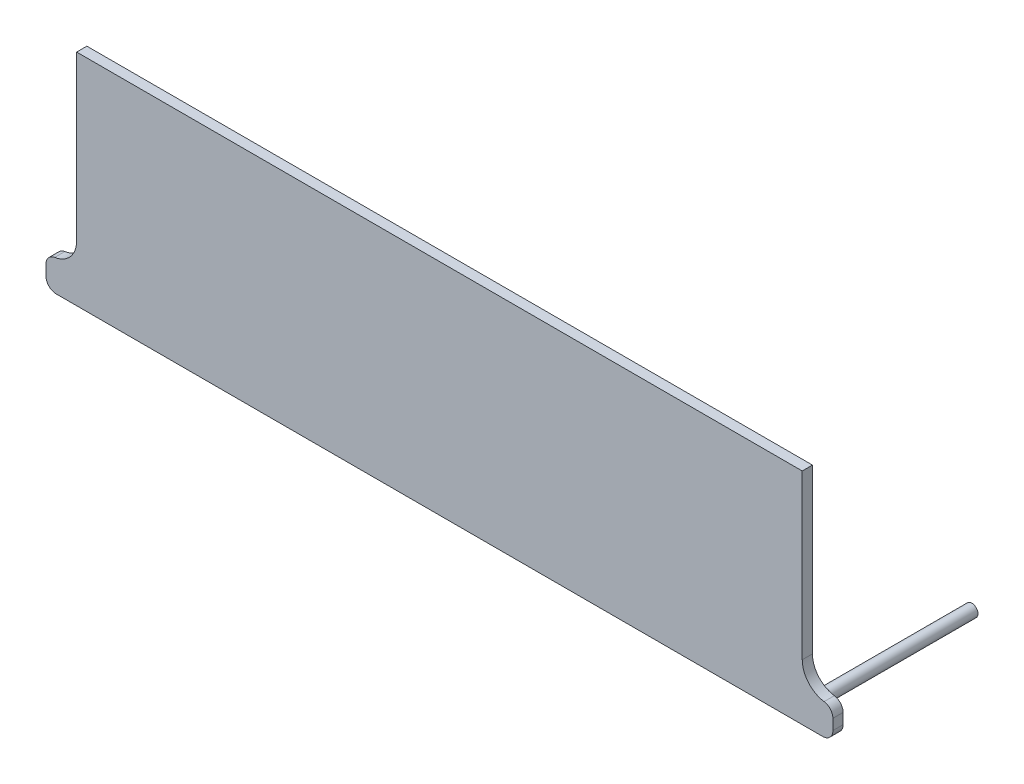
ISO-10303-21;
HEADER;
FILE_DESCRIPTION(('STEP AP214'),'2;1');
FILE_NAME('part.step','',(''),(''),'','','');
FILE_SCHEMA(('AUTOMOTIVE_DESIGN { 1 0 10303 214 1 1 1 1 }'));
ENDSEC;
DATA;
#1=APPLICATION_CONTEXT('core data for automotive mechanical design processes');
#2=APPLICATION_PROTOCOL_DEFINITION('international standard','automotive_design',2000,#1);
#3=PRODUCT_CONTEXT('',#1,'mechanical');
#4=PRODUCT('Part','Part','',(#3));
#5=PRODUCT_RELATED_PRODUCT_CATEGORY('part','',(#4));
#6=PRODUCT_DEFINITION_FORMATION('','',#4);
#7=PRODUCT_DEFINITION_CONTEXT('part definition',#1,'design');
#8=PRODUCT_DEFINITION('design','',#6,#7);
#9=PRODUCT_DEFINITION_SHAPE('','',#8);
#10=(LENGTH_UNIT() NAMED_UNIT(*) SI_UNIT(.MILLI.,.METRE.));
#11=(NAMED_UNIT(*) PLANE_ANGLE_UNIT() SI_UNIT($,.RADIAN.));
#12=(NAMED_UNIT(*) SI_UNIT($,.STERADIAN.) SOLID_ANGLE_UNIT());
#13=UNCERTAINTY_MEASURE_WITH_UNIT(LENGTH_MEASURE(1.E-05),#10,'distance_accuracy_value','');
#14=(GEOMETRIC_REPRESENTATION_CONTEXT(3) GLOBAL_UNCERTAINTY_ASSIGNED_CONTEXT((#13)) GLOBAL_UNIT_ASSIGNED_CONTEXT((#10,
#11,#12)) REPRESENTATION_CONTEXT('',''));
#15=CARTESIAN_POINT('',(0.,0.,0.));
#16=DIRECTION('',(0.,0.,1.));
#17=DIRECTION('',(1.,0.,0.));
#18=AXIS2_PLACEMENT_3D('',#15,#16,#17);
#19=CARTESIAN_POINT('',(385.,-107.5,5.));
#20=DIRECTION('',(-1.,0.,0.));
#21=DIRECTION('',(0.,0.,1.));
#22=AXIS2_PLACEMENT_3D('',#19,#20,#21);
#23=PLANE('',#22);
#24=DIRECTION('',(0.,1.,0.));
#25=VECTOR('',#24,1.);
#26=CARTESIAN_POINT('',(385.,-107.5,-5.));
#27=LINE('',#26,#25);
#28=CARTESIAN_POINT('',(385.,-97.5,-5.));
#29=VERTEX_POINT('',#28);
#30=CARTESIAN_POINT('',(385.,-87.1410161513776,-5.));
#31=VERTEX_POINT('',#30);
#32=EDGE_CURVE('E166',#29,#31,#27,.T.);
#33=ORIENTED_EDGE('',*,*,#32,.T.);
#34=DIRECTION('',(0.,0.,1.));
#35=VECTOR('',#34,1.);
#36=CARTESIAN_POINT('',(385.,-87.1410161513776,5.));
#37=LINE('',#36,#35);
#38=CARTESIAN_POINT('',(385.,-87.1410161513776,5.));
#39=VERTEX_POINT('',#38);
#40=EDGE_CURVE('E11',#31,#39,#37,.T.);
#41=ORIENTED_EDGE('',*,*,#40,.T.);
#42=DIRECTION('',(0.,1.,0.));
#43=VECTOR('',#42,1.);
#44=CARTESIAN_POINT('',(385.,-107.5,5.));
#45=LINE('',#44,#43);
#46=CARTESIAN_POINT('',(385.,-97.5,5.));
#47=VERTEX_POINT('',#46);
#48=EDGE_CURVE('E140',#47,#39,#45,.T.);
#49=ORIENTED_EDGE('',*,*,#48,.F.);
#50=DIRECTION('',(0.,0.,-1.));
#51=VECTOR('',#50,1.);
#52=CARTESIAN_POINT('',(385.,-97.5,5.));
#53=LINE('',#52,#51);
#54=EDGE_CURVE('E246',#47,#29,#53,.T.);
#55=ORIENTED_EDGE('',*,*,#54,.T.);
#56=EDGE_LOOP('',(#33,#41,#49,#55));
#57=FACE_BOUND('',#56,.T.);
#58=ADVANCED_FACE('F39',(#57),#23,.F.);
#59=CARTESIAN_POINT('',(355.,107.5,5.));
#60=DIRECTION('',(-1.,0.,0.));
#61=DIRECTION('',(0.,0.,1.));
#62=AXIS2_PLACEMENT_3D('',#59,#60,#61);
#63=PLANE('',#62);
#64=DIRECTION('',(0.,1.,0.));
#65=VECTOR('',#64,1.);
#66=CARTESIAN_POINT('',(355.,107.5,5.));
#67=LINE('',#66,#65);
#68=CARTESIAN_POINT('',(355.,-52.5,5.));
#69=VERTEX_POINT('',#68);
#70=CARTESIAN_POINT('',(355.,107.5,5.));
#71=VERTEX_POINT('',#70);
#72=EDGE_CURVE('E127',#69,#71,#67,.T.);
#73=ORIENTED_EDGE('',*,*,#72,.F.);
#74=DIRECTION('',(0.,0.,-1.));
#75=VECTOR('',#74,1.);
#76=CARTESIAN_POINT('',(355.,-52.5,-5.));
#77=LINE('',#76,#75);
#78=CARTESIAN_POINT('',(355.,-52.5,-5.));
#79=VERTEX_POINT('',#78);
#80=EDGE_CURVE('E150',#69,#79,#77,.T.);
#81=ORIENTED_EDGE('',*,*,#80,.T.);
#82=DIRECTION('',(0.,1.,0.));
#83=VECTOR('',#82,1.);
#84=CARTESIAN_POINT('',(355.,107.5,-5.));
#85=LINE('',#84,#83);
#86=CARTESIAN_POINT('',(355.,107.5,-5.));
#87=VERTEX_POINT('',#86);
#88=EDGE_CURVE('E146',#79,#87,#85,.T.);
#89=ORIENTED_EDGE('',*,*,#88,.T.);
#90=DIRECTION('',(0.,0.,-1.));
#91=VECTOR('',#90,1.);
#92=CARTESIAN_POINT('',(355.,107.5,5.));
#93=LINE('',#92,#91);
#94=EDGE_CURVE('E143',#71,#87,#93,.T.);
#95=ORIENTED_EDGE('',*,*,#94,.F.);
#96=EDGE_LOOP('',(#73,#81,#89,#95));
#97=FACE_BOUND('',#96,.T.);
#98=ADVANCED_FACE('F144',(#97),#63,.F.);
#99=CARTESIAN_POINT('',(-355.,107.5,5.));
#100=DIRECTION('',(0.,-1.,0.));
#101=DIRECTION('',(0.,0.,-1.));
#102=AXIS2_PLACEMENT_3D('',#99,#100,#101);
#103=PLANE('',#102);
#104=DIRECTION('',(-1.,0.,0.));
#105=VECTOR('',#104,1.);
#106=CARTESIAN_POINT('',(-355.,107.5,-5.));
#107=LINE('',#106,#105);
#108=CARTESIAN_POINT('',(-355.,107.5,-5.));
#109=VERTEX_POINT('',#108);
#110=EDGE_CURVE('E172',#87,#109,#107,.T.);
#111=ORIENTED_EDGE('',*,*,#110,.T.);
#112=DIRECTION('',(0.,0.,-1.));
#113=VECTOR('',#112,1.);
#114=CARTESIAN_POINT('',(-355.,107.5,5.));
#115=LINE('',#114,#113);
#116=CARTESIAN_POINT('',(-355.,107.5,5.));
#117=VERTEX_POINT('',#116);
#118=EDGE_CURVE('E151',#117,#109,#115,.T.);
#119=ORIENTED_EDGE('',*,*,#118,.F.);
#120=DIRECTION('',(-1.,0.,0.));
#121=VECTOR('',#120,1.);
#122=CARTESIAN_POINT('',(-355.,107.5,5.));
#123=LINE('',#122,#121);
#124=EDGE_CURVE('E133',#71,#117,#123,.T.);
#125=ORIENTED_EDGE('',*,*,#124,.F.);
#126=ORIENTED_EDGE('',*,*,#94,.T.);
#127=EDGE_LOOP('',(#111,#119,#125,#126));
#128=FACE_BOUND('',#127,.T.);
#129=ADVANCED_FACE('F153',(#128),#103,.F.);
#130=CARTESIAN_POINT('',(-355.,107.5,5.));
#131=DIRECTION('',(1.,0.,0.));
#132=DIRECTION('',(0.,0.,-1.));
#133=AXIS2_PLACEMENT_3D('',#130,#131,#132);
#134=PLANE('',#133);
#135=DIRECTION('',(0.,-1.,0.));
#136=VECTOR('',#135,1.);
#137=CARTESIAN_POINT('',(-355.,107.5,-5.));
#138=LINE('',#137,#136);
#139=CARTESIAN_POINT('',(-355.,-52.5,-5.));
#140=VERTEX_POINT('',#139);
#141=EDGE_CURVE('E175',#109,#140,#138,.T.);
#142=ORIENTED_EDGE('',*,*,#141,.T.);
#143=DIRECTION('',(0.,0.,-1.));
#144=VECTOR('',#143,1.);
#145=CARTESIAN_POINT('',(-355.,-52.5000000000001,5.));
#146=LINE('',#145,#144);
#147=CARTESIAN_POINT('',(-355.,-52.5,5.));
#148=VERTEX_POINT('',#147);
#149=EDGE_CURVE('E191',#140,#148,#146,.F.);
#150=ORIENTED_EDGE('',*,*,#149,.T.);
#151=DIRECTION('',(0.,-1.,0.));
#152=VECTOR('',#151,1.);
#153=CARTESIAN_POINT('',(-355.,107.5,5.));
#154=LINE('',#153,#152);
#155=EDGE_CURVE('E157',#117,#148,#154,.T.);
#156=ORIENTED_EDGE('',*,*,#155,.F.);
#157=ORIENTED_EDGE('',*,*,#118,.T.);
#158=EDGE_LOOP('',(#142,#150,#156,#157));
#159=FACE_BOUND('',#158,.T.);
#160=ADVANCED_FACE('F279',(#159),#134,.F.);
#161=CARTESIAN_POINT('',(-385.,-107.5,5.));
#162=DIRECTION('',(1.,0.,0.));
#163=DIRECTION('',(0.,0.,-1.));
#164=AXIS2_PLACEMENT_3D('',#161,#162,#163);
#165=PLANE('',#164);
#166=DIRECTION('',(0.,-1.,0.));
#167=VECTOR('',#166,1.);
#168=CARTESIAN_POINT('',(-385.,-107.5,5.));
#169=LINE('',#168,#167);
#170=CARTESIAN_POINT('',(-385.,-87.1410161513776,5.));
#171=VERTEX_POINT('',#170);
#172=CARTESIAN_POINT('',(-385.,-97.5,5.));
#173=VERTEX_POINT('',#172);
#174=EDGE_CURVE('E160',#171,#173,#169,.T.);
#175=ORIENTED_EDGE('',*,*,#174,.F.);
#176=DIRECTION('',(0.,0.,1.));
#177=VECTOR('',#176,1.);
#178=CARTESIAN_POINT('',(-385.,-87.1410161513776,5.));
#179=LINE('',#178,#177);
#180=CARTESIAN_POINT('',(-385.,-87.1410161513776,-5.));
#181=VERTEX_POINT('',#180);
#182=EDGE_CURVE('E250',#171,#181,#179,.F.);
#183=ORIENTED_EDGE('',*,*,#182,.T.);
#184=DIRECTION('',(0.,-1.,0.));
#185=VECTOR('',#184,1.);
#186=CARTESIAN_POINT('',(-385.,-107.5,-5.));
#187=LINE('',#186,#185);
#188=CARTESIAN_POINT('',(-385.,-97.5,-5.));
#189=VERTEX_POINT('',#188);
#190=EDGE_CURVE('E179',#181,#189,#187,.T.);
#191=ORIENTED_EDGE('',*,*,#190,.T.);
#192=DIRECTION('',(0.,0.,-1.));
#193=VECTOR('',#192,1.);
#194=CARTESIAN_POINT('',(-385.,-97.5,5.));
#195=LINE('',#194,#193);
#196=EDGE_CURVE('E236',#189,#173,#195,.F.);
#197=ORIENTED_EDGE('',*,*,#196,.T.);
#198=EDGE_LOOP('',(#175,#183,#191,#197));
#199=FACE_BOUND('',#198,.T.);
#200=ADVANCED_FACE('F292',(#199),#165,.F.);
#201=CARTESIAN_POINT('',(-355.,-107.5,5.));
#202=DIRECTION('',(0.,1.,0.));
#203=DIRECTION('',(0.,0.,1.));
#204=AXIS2_PLACEMENT_3D('',#201,#202,#203);
#205=PLANE('',#204);
#206=DIRECTION('',(1.,0.,0.));
#207=VECTOR('',#206,1.);
#208=CARTESIAN_POINT('',(355.,-107.5,5.));
#209=LINE('',#208,#207);
#210=CARTESIAN_POINT('',(-375.,-107.5,5.));
#211=VERTEX_POINT('',#210);
#212=CARTESIAN_POINT('',(375.,-107.5,5.));
#213=VERTEX_POINT('',#212);
#214=EDGE_CURVE('E186',#211,#213,#209,.T.);
#215=ORIENTED_EDGE('',*,*,#214,.F.);
#216=DIRECTION('',(0.,0.,-1.));
#217=VECTOR('',#216,1.);
#218=CARTESIAN_POINT('',(-375.,-107.5,5.));
#219=LINE('',#218,#217);
#220=CARTESIAN_POINT('',(-375.,-107.5,-5.));
#221=VERTEX_POINT('',#220);
#222=EDGE_CURVE('E232',#211,#221,#219,.T.);
#223=ORIENTED_EDGE('',*,*,#222,.T.);
#224=DIRECTION('',(1.,0.,0.));
#225=VECTOR('',#224,1.);
#226=CARTESIAN_POINT('',(-355.,-107.5,-5.));
#227=LINE('',#226,#225);
#228=CARTESIAN_POINT('',(375.,-107.5,-5.));
#229=VERTEX_POINT('',#228);
#230=EDGE_CURVE('E182',#221,#229,#227,.T.);
#231=ORIENTED_EDGE('',*,*,#230,.T.);
#232=DIRECTION('',(0.,0.,-1.));
#233=VECTOR('',#232,1.);
#234=CARTESIAN_POINT('',(375.,-107.5,5.));
#235=LINE('',#234,#233);
#236=EDGE_CURVE('E229',#229,#213,#235,.F.);
#237=ORIENTED_EDGE('',*,*,#236,.T.);
#238=EDGE_LOOP('',(#215,#223,#231,#237));
#239=FACE_BOUND('',#238,.T.);
#240=ADVANCED_FACE('F302',(#239),#205,.F.);
#241=CARTESIAN_POINT('',(0.,0.,5.));
#242=DIRECTION('',(0.,0.,1.));
#243=DIRECTION('',(1.,0.,0.));
#244=AXIS2_PLACEMENT_3D('',#241,#242,#243);
#245=PLANE('',#244);
#246=CARTESIAN_POINT('',(-380.,-52.5000000000001,5.));
#247=DIRECTION('',(0.,0.,1.));
#248=DIRECTION('',(1.,0.,0.));
#249=AXIS2_PLACEMENT_3D('',#246,#247,#248);
#250=CIRCLE('',#249,25.);
#251=CARTESIAN_POINT('',(-376.428571428571,-77.2435829652697,5.));
#252=VERTEX_POINT('',#251);
#253=EDGE_CURVE('E203',#148,#252,#250,.F.);
#254=ORIENTED_EDGE('',*,*,#253,.T.);
#255=CARTESIAN_POINT('',(-375.,-87.1410161513776,5.));
#256=DIRECTION('',(0.,0.,1.));
#257=DIRECTION('',(1.,0.,0.));
#258=AXIS2_PLACEMENT_3D('',#255,#256,#257);
#259=CIRCLE('',#258,10.);
#260=EDGE_CURVE('E265',#252,#171,#259,.T.);
#261=ORIENTED_EDGE('',*,*,#260,.T.);
#262=ORIENTED_EDGE('',*,*,#174,.T.);
#263=CARTESIAN_POINT('',(-375.,-97.5,5.));
#264=DIRECTION('',(0.,0.,1.));
#265=DIRECTION('',(1.,0.,0.));
#266=AXIS2_PLACEMENT_3D('',#263,#264,#265);
#267=CIRCLE('',#266,10.);
#268=EDGE_CURVE('E243',#173,#211,#267,.T.);
#269=ORIENTED_EDGE('',*,*,#268,.T.);
#270=ORIENTED_EDGE('',*,*,#214,.T.);
#271=CARTESIAN_POINT('',(375.,-97.5,5.));
#272=DIRECTION('',(0.,0.,1.));
#273=DIRECTION('',(1.,0.,0.));
#274=AXIS2_PLACEMENT_3D('',#271,#272,#273);
#275=CIRCLE('',#274,10.);
#276=EDGE_CURVE('E240',#213,#47,#275,.T.);
#277=ORIENTED_EDGE('',*,*,#276,.T.);
#278=ORIENTED_EDGE('',*,*,#48,.T.);
#279=CARTESIAN_POINT('',(375.,-87.1410161513776,5.));
#280=DIRECTION('',(0.,0.,1.));
#281=DIRECTION('',(1.,0.,0.));
#282=AXIS2_PLACEMENT_3D('',#279,#280,#281);
#283=CIRCLE('',#282,10.);
#284=CARTESIAN_POINT('',(376.428571428571,-77.2435829652697,5.));
#285=VERTEX_POINT('',#284);
#286=EDGE_CURVE('E55',#39,#285,#283,.T.);
#287=ORIENTED_EDGE('',*,*,#286,.T.);
#288=CARTESIAN_POINT('',(380.,-52.5,5.));
#289=DIRECTION('',(0.,0.,1.));
#290=DIRECTION('',(1.,0.,0.));
#291=AXIS2_PLACEMENT_3D('',#288,#289,#290);
#292=CIRCLE('',#291,25.);
#293=EDGE_CURVE('E135',#285,#69,#292,.F.);
#294=ORIENTED_EDGE('',*,*,#293,.T.);
#295=ORIENTED_EDGE('',*,*,#72,.T.);
#296=ORIENTED_EDGE('',*,*,#124,.T.);
#297=ORIENTED_EDGE('',*,*,#155,.T.);
#298=EDGE_LOOP('',(#254,#261,#262,#269,#270,#277,#278,#287,#294,#295,#296,#297));
#299=FACE_BOUND('',#298,.T.);
#300=ADVANCED_FACE('F130',(#299),#245,.T.);
#301=CARTESIAN_POINT('',(0.,0.,-5.));
#302=DIRECTION('',(0.,0.,1.));
#303=DIRECTION('',(1.,0.,0.));
#304=AXIS2_PLACEMENT_3D('',#301,#302,#303);
#305=PLANE('',#304);
#306=CARTESIAN_POINT('',(-358.,-90.5,-5.));
#307=DIRECTION('',(0.,0.,1.));
#308=DIRECTION('',(1.,0.,0.));
#309=AXIS2_PLACEMENT_3D('',#306,#307,#308);
#310=CIRCLE('',#309,16.);
#311=CARTESIAN_POINT('',(-342.,-90.5,-5.));
#312=VERTEX_POINT('',#311);
#313=EDGE_CURVE('E221',#312,#312,#310,.T.);
#314=ORIENTED_EDGE('',*,*,#313,.T.);
#315=EDGE_LOOP('',(#314));
#316=FACE_BOUND('',#315,.T.);
#317=CARTESIAN_POINT('',(358.,-90.5,-5.));
#318=DIRECTION('',(0.,0.,1.));
#319=DIRECTION('',(1.,0.,0.));
#320=AXIS2_PLACEMENT_3D('',#317,#318,#319);
#321=CIRCLE('',#320,16.);
#322=CARTESIAN_POINT('',(374.,-90.5,-5.));
#323=VERTEX_POINT('',#322);
#324=EDGE_CURVE('E217',#323,#323,#321,.T.);
#325=ORIENTED_EDGE('',*,*,#324,.T.);
#326=EDGE_LOOP('',(#325));
#327=FACE_BOUND('',#326,.T.);
#328=ORIENTED_EDGE('',*,*,#190,.F.);
#329=CARTESIAN_POINT('',(-375.,-87.1410161513776,-5.));
#330=DIRECTION('',(0.,0.,1.));
#331=DIRECTION('',(1.,0.,0.));
#332=AXIS2_PLACEMENT_3D('',#329,#330,#331);
#333=CIRCLE('',#332,10.);
#334=CARTESIAN_POINT('',(-376.428571428571,-77.2435829652697,-5.));
#335=VERTEX_POINT('',#334);
#336=EDGE_CURVE('E257',#181,#335,#333,.F.);
#337=ORIENTED_EDGE('',*,*,#336,.T.);
#338=CARTESIAN_POINT('',(-380.,-52.5000000000001,-5.));
#339=DIRECTION('',(0.,0.,1.));
#340=DIRECTION('',(1.,0.,0.));
#341=AXIS2_PLACEMENT_3D('',#338,#339,#340);
#342=CIRCLE('',#341,25.);
#343=EDGE_CURVE('E200',#335,#140,#342,.T.);
#344=ORIENTED_EDGE('',*,*,#343,.T.);
#345=ORIENTED_EDGE('',*,*,#141,.F.);
#346=ORIENTED_EDGE('',*,*,#110,.F.);
#347=ORIENTED_EDGE('',*,*,#88,.F.);
#348=CARTESIAN_POINT('',(380.,-52.5,-5.));
#349=DIRECTION('',(0.,0.,1.));
#350=DIRECTION('',(1.,0.,0.));
#351=AXIS2_PLACEMENT_3D('',#348,#349,#350);
#352=CIRCLE('',#351,25.);
#353=CARTESIAN_POINT('',(376.428571428571,-77.2435829652697,-5.));
#354=VERTEX_POINT('',#353);
#355=EDGE_CURVE('E194',#79,#354,#352,.T.);
#356=ORIENTED_EDGE('',*,*,#355,.T.);
#357=CARTESIAN_POINT('',(375.,-87.1410161513776,-5.));
#358=DIRECTION('',(0.,0.,1.));
#359=DIRECTION('',(1.,0.,0.));
#360=AXIS2_PLACEMENT_3D('',#357,#358,#359);
#361=CIRCLE('',#360,10.);
#362=EDGE_CURVE('E254',#354,#31,#361,.F.);
#363=ORIENTED_EDGE('',*,*,#362,.T.);
#364=ORIENTED_EDGE('',*,*,#32,.F.);
#365=CARTESIAN_POINT('',(375.,-97.5,-5.));
#366=DIRECTION('',(0.,0.,1.));
#367=DIRECTION('',(1.,0.,0.));
#368=AXIS2_PLACEMENT_3D('',#365,#366,#367);
#369=CIRCLE('',#368,10.);
#370=EDGE_CURVE('E210',#29,#229,#369,.F.);
#371=ORIENTED_EDGE('',*,*,#370,.T.);
#372=ORIENTED_EDGE('',*,*,#230,.F.);
#373=CARTESIAN_POINT('',(-375.,-97.5,-5.));
#374=DIRECTION('',(0.,0.,1.));
#375=DIRECTION('',(1.,0.,0.));
#376=AXIS2_PLACEMENT_3D('',#373,#374,#375);
#377=CIRCLE('',#376,10.);
#378=EDGE_CURVE('E213',#221,#189,#377,.F.);
#379=ORIENTED_EDGE('',*,*,#378,.T.);
#380=EDGE_LOOP('',(#328,#337,#344,#345,#346,#347,#356,#363,#364,#371,#372,#379));
#381=FACE_BOUND('',#380,.T.);
#382=ADVANCED_FACE('F275',(#316,#327,#381),#305,.F.);
#383=CARTESIAN_POINT('',(380.,-52.5,5.));
#384=DIRECTION('',(0.,0.,1.));
#385=DIRECTION('',(1.,0.,0.));
#386=AXIS2_PLACEMENT_3D('',#383,#384,#385);
#387=CYLINDRICAL_SURFACE('',#386,25.);
#388=ORIENTED_EDGE('',*,*,#293,.F.);
#389=DIRECTION('',(0.,0.,1.));
#390=VECTOR('',#389,1.);
#391=CARTESIAN_POINT('',(376.428571428571,-77.2435829652697,5.));
#392=LINE('',#391,#390);
#393=EDGE_CURVE('E48',#285,#354,#392,.F.);
#394=ORIENTED_EDGE('',*,*,#393,.T.);
#395=ORIENTED_EDGE('',*,*,#355,.F.);
#396=ORIENTED_EDGE('',*,*,#80,.F.);
#397=EDGE_LOOP('',(#388,#394,#395,#396));
#398=FACE_BOUND('',#397,.T.);
#399=ADVANCED_FACE('F271',(#398),#387,.F.);
#400=CARTESIAN_POINT('',(-380.,-52.5000000000001,5.));
#401=DIRECTION('',(0.,0.,1.));
#402=DIRECTION('',(1.,0.,0.));
#403=AXIS2_PLACEMENT_3D('',#400,#401,#402);
#404=CYLINDRICAL_SURFACE('',#403,25.);
#405=ORIENTED_EDGE('',*,*,#343,.F.);
#406=DIRECTION('',(0.,0.,1.));
#407=VECTOR('',#406,1.);
#408=CARTESIAN_POINT('',(-376.428571428571,-77.2435829652697,5.));
#409=LINE('',#408,#407);
#410=EDGE_CURVE('E260',#335,#252,#409,.T.);
#411=ORIENTED_EDGE('',*,*,#410,.T.);
#412=ORIENTED_EDGE('',*,*,#253,.F.);
#413=ORIENTED_EDGE('',*,*,#149,.F.);
#414=EDGE_LOOP('',(#405,#411,#412,#413));
#415=FACE_BOUND('',#414,.T.);
#416=ADVANCED_FACE('F285',(#415),#404,.F.);
#417=CARTESIAN_POINT('',(358.,-90.5,-158.));
#418=DIRECTION('',(0.,0.,1.));
#419=DIRECTION('',(1.,0.,0.));
#420=AXIS2_PLACEMENT_3D('',#417,#418,#419);
#421=CYLINDRICAL_SURFACE('',#420,5.99999999999999);
#422=CARTESIAN_POINT('',(358.,-90.5,-15.));
#423=DIRECTION('',(0.,0.,1.));
#424=DIRECTION('',(1.,0.,0.));
#425=AXIS2_PLACEMENT_3D('',#422,#423,#424);
#426=CIRCLE('',#425,5.99999999999999);
#427=CARTESIAN_POINT('',(364.,-90.5,-15.));
#428=VERTEX_POINT('',#427);
#429=EDGE_CURVE('E225',#428,#428,#426,.F.);
#430=ORIENTED_EDGE('',*,*,#429,.T.);
#431=EDGE_LOOP('',(#430));
#432=FACE_BOUND('',#431,.T.);
#433=CARTESIAN_POINT('',(358.,-90.5,-158.));
#434=DIRECTION('',(0.,0.,-1.));
#435=DIRECTION('',(-1.,0.,0.));
#436=AXIS2_PLACEMENT_3D('',#433,#434,#435);
#437=CIRCLE('',#436,5.99999999999999);
#438=CARTESIAN_POINT('',(352.,-90.5,-158.));
#439=VERTEX_POINT('',#438);
#440=EDGE_CURVE('E169',#439,#439,#437,.T.);
#441=ORIENTED_EDGE('',*,*,#440,.F.);
#442=EDGE_LOOP('',(#441));
#443=FACE_BOUND('',#442,.T.);
#444=ADVANCED_FACE('F330',(#432,#443),#421,.T.);
#445=CARTESIAN_POINT('',(358.,-90.5,-158.));
#446=DIRECTION('',(0.,0.,-1.));
#447=DIRECTION('',(-1.,0.,0.));
#448=AXIS2_PLACEMENT_3D('',#445,#446,#447);
#449=PLANE('',#448);
#450=ORIENTED_EDGE('',*,*,#440,.T.);
#451=EDGE_LOOP('',(#450));
#452=FACE_BOUND('',#451,.T.);
#453=ADVANCED_FACE('F321',(#452),#449,.T.);
#454=CARTESIAN_POINT('',(-358.,-90.5,-158.));
#455=DIRECTION('',(0.,0.,1.));
#456=DIRECTION('',(1.,0.,0.));
#457=AXIS2_PLACEMENT_3D('',#454,#455,#456);
#458=CYLINDRICAL_SURFACE('',#457,5.99999999999999);
#459=CARTESIAN_POINT('',(-358.,-90.5,-15.));
#460=DIRECTION('',(0.,0.,1.));
#461=DIRECTION('',(1.,0.,0.));
#462=AXIS2_PLACEMENT_3D('',#459,#460,#461);
#463=CIRCLE('',#462,5.99999999999999);
#464=CARTESIAN_POINT('',(-352.,-90.5,-15.));
#465=VERTEX_POINT('',#464);
#466=EDGE_CURVE('E206',#465,#465,#463,.F.);
#467=ORIENTED_EDGE('',*,*,#466,.T.);
#468=EDGE_LOOP('',(#467));
#469=FACE_BOUND('',#468,.T.);
#470=CARTESIAN_POINT('',(-358.,-90.5,-158.));
#471=DIRECTION('',(0.,0.,-1.));
#472=DIRECTION('',(-1.,0.,0.));
#473=AXIS2_PLACEMENT_3D('',#470,#471,#472);
#474=CIRCLE('',#473,5.99999999999999);
#475=CARTESIAN_POINT('',(-364.,-90.5,-158.));
#476=VERTEX_POINT('',#475);
#477=EDGE_CURVE('E312',#476,#476,#474,.T.);
#478=ORIENTED_EDGE('',*,*,#477,.F.);
#479=EDGE_LOOP('',(#478));
#480=FACE_BOUND('',#479,.T.);
#481=ADVANCED_FACE('F319',(#469,#480),#458,.T.);
#482=CARTESIAN_POINT('',(-358.,-90.5,-158.));
#483=DIRECTION('',(0.,0.,-1.));
#484=DIRECTION('',(-1.,0.,0.));
#485=AXIS2_PLACEMENT_3D('',#482,#483,#484);
#486=PLANE('',#485);
#487=ORIENTED_EDGE('',*,*,#477,.T.);
#488=EDGE_LOOP('',(#487));
#489=FACE_BOUND('',#488,.T.);
#490=ADVANCED_FACE('F317',(#489),#486,.T.);
#491=CARTESIAN_POINT('',(-358.,-90.5,-15.));
#492=DIRECTION('',(0.,0.,1.));
#493=DIRECTION('',(1.,0.,0.));
#494=AXIS2_PLACEMENT_3D('',#491,#492,#493);
#495=TOROIDAL_SURFACE('',#494,16.,10.);
#496=ORIENTED_EDGE('',*,*,#313,.F.);
#497=EDGE_LOOP('',(#496));
#498=FACE_BOUND('',#497,.T.);
#499=ORIENTED_EDGE('',*,*,#466,.F.);
#500=EDGE_LOOP('',(#499));
#501=FACE_BOUND('',#500,.T.);
#502=ADVANCED_FACE('F328',(#498,#501),#495,.F.);
#503=CARTESIAN_POINT('',(358.,-90.5,-15.));
#504=DIRECTION('',(0.,0.,1.));
#505=DIRECTION('',(1.,0.,0.));
#506=AXIS2_PLACEMENT_3D('',#503,#504,#505);
#507=TOROIDAL_SURFACE('',#506,16.,10.);
#508=ORIENTED_EDGE('',*,*,#324,.F.);
#509=EDGE_LOOP('',(#508));
#510=FACE_BOUND('',#509,.T.);
#511=ORIENTED_EDGE('',*,*,#429,.F.);
#512=EDGE_LOOP('',(#511));
#513=FACE_BOUND('',#512,.T.);
#514=ADVANCED_FACE('F347',(#510,#513),#507,.F.);
#515=CARTESIAN_POINT('',(-375.,-97.5,5.));
#516=DIRECTION('',(0.,0.,-1.));
#517=DIRECTION('',(-1.,0.,0.));
#518=AXIS2_PLACEMENT_3D('',#515,#516,#517);
#519=CYLINDRICAL_SURFACE('',#518,10.);
#520=ORIENTED_EDGE('',*,*,#268,.F.);
#521=ORIENTED_EDGE('',*,*,#196,.F.);
#522=ORIENTED_EDGE('',*,*,#378,.F.);
#523=ORIENTED_EDGE('',*,*,#222,.F.);
#524=EDGE_LOOP('',(#520,#521,#522,#523));
#525=FACE_BOUND('',#524,.T.);
#526=ADVANCED_FACE('F297',(#525),#519,.T.);
#527=CARTESIAN_POINT('',(375.,-97.5,5.));
#528=DIRECTION('',(0.,0.,-1.));
#529=DIRECTION('',(-1.,0.,0.));
#530=AXIS2_PLACEMENT_3D('',#527,#528,#529);
#531=CYLINDRICAL_SURFACE('',#530,10.);
#532=ORIENTED_EDGE('',*,*,#276,.F.);
#533=ORIENTED_EDGE('',*,*,#236,.F.);
#534=ORIENTED_EDGE('',*,*,#370,.F.);
#535=ORIENTED_EDGE('',*,*,#54,.F.);
#536=EDGE_LOOP('',(#532,#533,#534,#535));
#537=FACE_BOUND('',#536,.T.);
#538=ADVANCED_FACE('F354',(#537),#531,.T.);
#539=CARTESIAN_POINT('',(-375.,-87.1410161513776,5.));
#540=DIRECTION('',(0.,0.,1.));
#541=DIRECTION('',(1.,0.,0.));
#542=AXIS2_PLACEMENT_3D('',#539,#540,#541);
#543=CYLINDRICAL_SURFACE('',#542,10.);
#544=ORIENTED_EDGE('',*,*,#260,.F.);
#545=ORIENTED_EDGE('',*,*,#410,.F.);
#546=ORIENTED_EDGE('',*,*,#336,.F.);
#547=ORIENTED_EDGE('',*,*,#182,.F.);
#548=EDGE_LOOP('',(#544,#545,#546,#547));
#549=FACE_BOUND('',#548,.T.);
#550=ADVANCED_FACE('F288',(#549),#543,.T.);
#551=CARTESIAN_POINT('',(375.,-87.1410161513776,5.));
#552=DIRECTION('',(0.,0.,1.));
#553=DIRECTION('',(1.,0.,0.));
#554=AXIS2_PLACEMENT_3D('',#551,#552,#553);
#555=CYLINDRICAL_SURFACE('',#554,10.);
#556=ORIENTED_EDGE('',*,*,#286,.F.);
#557=ORIENTED_EDGE('',*,*,#40,.F.);
#558=ORIENTED_EDGE('',*,*,#362,.F.);
#559=ORIENTED_EDGE('',*,*,#393,.F.);
#560=EDGE_LOOP('',(#556,#557,#558,#559));
#561=FACE_BOUND('',#560,.T.);
#562=ADVANCED_FACE('F41',(#561),#555,.T.);
#563=CLOSED_SHELL('',(#58,#98,#129,#160,#200,#240,#300,#382,#399,#416,#444,#453,#481,#490,#502,
#514,#526,#538,#550,#562));
#564=MANIFOLD_SOLID_BREP('B2',#563);
#565=ADVANCED_BREP_SHAPE_REPRESENTATION('',(#18,#564),#14);
#566=SHAPE_DEFINITION_REPRESENTATION(#9,#565);
ENDSEC;
END-ISO-10303-21;
